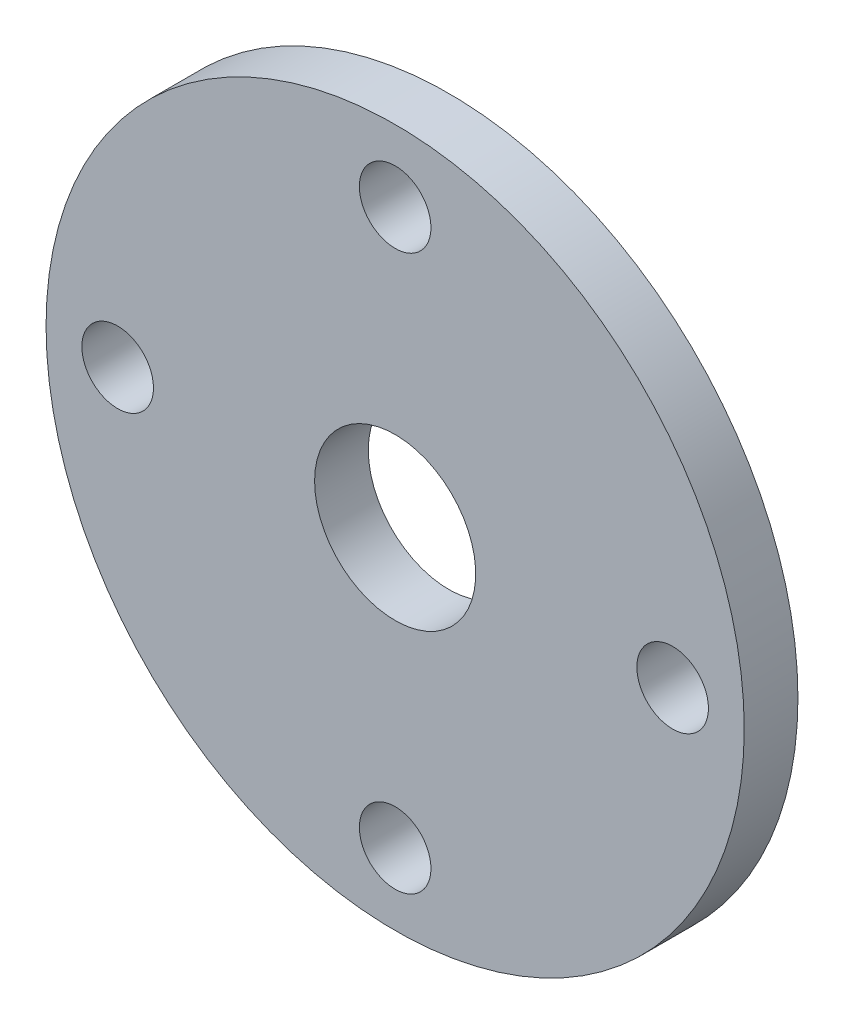
ISO-10303-21;
HEADER;
FILE_DESCRIPTION(('STEP AP214'),'2;1');
FILE_NAME('part.step','',(''),(''),'','','');
FILE_SCHEMA(('AUTOMOTIVE_DESIGN { 1 0 10303 214 1 1 1 1 }'));
ENDSEC;
DATA;
#1=APPLICATION_CONTEXT('core data for automotive mechanical design processes');
#2=APPLICATION_PROTOCOL_DEFINITION('international standard','automotive_design',2000,#1);
#3=PRODUCT_CONTEXT('',#1,'mechanical');
#4=PRODUCT('Part','Part','',(#3));
#5=PRODUCT_RELATED_PRODUCT_CATEGORY('part','',(#4));
#6=PRODUCT_DEFINITION_FORMATION('','',#4);
#7=PRODUCT_DEFINITION_CONTEXT('part definition',#1,'design');
#8=PRODUCT_DEFINITION('design','',#6,#7);
#9=PRODUCT_DEFINITION_SHAPE('','',#8);
#10=(LENGTH_UNIT() NAMED_UNIT(*) SI_UNIT(.MILLI.,.METRE.));
#11=(NAMED_UNIT(*) PLANE_ANGLE_UNIT() SI_UNIT($,.RADIAN.));
#12=(NAMED_UNIT(*) SI_UNIT($,.STERADIAN.) SOLID_ANGLE_UNIT());
#13=UNCERTAINTY_MEASURE_WITH_UNIT(LENGTH_MEASURE(1.E-05),#10,'distance_accuracy_value','');
#14=(GEOMETRIC_REPRESENTATION_CONTEXT(3) GLOBAL_UNCERTAINTY_ASSIGNED_CONTEXT((#13)) GLOBAL_UNIT_ASSIGNED_CONTEXT((#10,
#11,#12)) REPRESENTATION_CONTEXT('',''));
#15=CARTESIAN_POINT('',(0.,0.,0.));
#16=DIRECTION('',(0.,0.,1.));
#17=DIRECTION('',(1.,0.,0.));
#18=AXIS2_PLACEMENT_3D('',#15,#16,#17);
#19=CARTESIAN_POINT('',(0.,0.,3.));
#20=DIRECTION('',(0.,0.,1.));
#21=DIRECTION('',(1.,0.,0.));
#22=AXIS2_PLACEMENT_3D('',#19,#20,#21);
#23=PLANE('',#22);
#24=CARTESIAN_POINT('',(0.,0.,3.));
#25=DIRECTION('',(0.,0.,-1.));
#26=DIRECTION('',(-1.,0.,0.));
#27=AXIS2_PLACEMENT_3D('',#24,#25,#26);
#28=CIRCLE('',#27,4.5);
#29=CARTESIAN_POINT('',(-4.5,0.,3.));
#30=VERTEX_POINT('',#29);
#31=EDGE_CURVE('E74',#30,#30,#28,.T.);
#32=ORIENTED_EDGE('',*,*,#31,.T.);
#33=EDGE_LOOP('',(#32));
#34=FACE_BOUND('',#33,.T.);
#35=CARTESIAN_POINT('',(0.,15.5,3.));
#36=DIRECTION('',(0.,0.,1.));
#37=DIRECTION('',(1.,0.,0.));
#38=AXIS2_PLACEMENT_3D('',#35,#36,#37);
#39=CIRCLE('',#38,2.);
#40=CARTESIAN_POINT('',(2.,15.5,3.));
#41=VERTEX_POINT('',#40);
#42=EDGE_CURVE('E57',#41,#41,#39,.T.);
#43=ORIENTED_EDGE('',*,*,#42,.F.);
#44=EDGE_LOOP('',(#43));
#45=FACE_BOUND('',#44,.T.);
#46=CARTESIAN_POINT('',(0.,-15.5,3.));
#47=DIRECTION('',(0.,0.,1.));
#48=DIRECTION('',(1.,0.,0.));
#49=AXIS2_PLACEMENT_3D('',#46,#47,#48);
#50=CIRCLE('',#49,2.);
#51=CARTESIAN_POINT('',(2.,-15.5,3.));
#52=VERTEX_POINT('',#51);
#53=EDGE_CURVE('E46',#52,#52,#50,.T.);
#54=ORIENTED_EDGE('',*,*,#53,.F.);
#55=EDGE_LOOP('',(#54));
#56=FACE_BOUND('',#55,.T.);
#57=CARTESIAN_POINT('',(0.,0.,3.));
#58=DIRECTION('',(0.,0.,1.));
#59=DIRECTION('',(1.,0.,0.));
#60=AXIS2_PLACEMENT_3D('',#57,#58,#59);
#61=CIRCLE('',#60,19.5);
#62=CARTESIAN_POINT('',(19.5,0.,3.));
#63=VERTEX_POINT('',#62);
#64=EDGE_CURVE('E10',#63,#63,#61,.T.);
#65=ORIENTED_EDGE('',*,*,#64,.T.);
#66=EDGE_LOOP('',(#65));
#67=FACE_BOUND('',#66,.T.);
#68=CARTESIAN_POINT('',(15.5,0.,3.));
#69=DIRECTION('',(0.,0.,1.));
#70=DIRECTION('',(1.,0.,0.));
#71=AXIS2_PLACEMENT_3D('',#68,#69,#70);
#72=CIRCLE('',#71,2.);
#73=CARTESIAN_POINT('',(17.5,0.,3.));
#74=VERTEX_POINT('',#73);
#75=EDGE_CURVE('E51',#74,#74,#72,.T.);
#76=ORIENTED_EDGE('',*,*,#75,.F.);
#77=EDGE_LOOP('',(#76));
#78=FACE_BOUND('',#77,.T.);
#79=CARTESIAN_POINT('',(-15.5,0.,3.));
#80=DIRECTION('',(0.,0.,1.));
#81=DIRECTION('',(1.,0.,0.));
#82=AXIS2_PLACEMENT_3D('',#79,#80,#81);
#83=CIRCLE('',#82,2.);
#84=CARTESIAN_POINT('',(-13.5,0.,3.));
#85=VERTEX_POINT('',#84);
#86=EDGE_CURVE('E63',#85,#85,#83,.T.);
#87=ORIENTED_EDGE('',*,*,#86,.F.);
#88=EDGE_LOOP('',(#87));
#89=FACE_BOUND('',#88,.T.);
#90=ADVANCED_FACE('F35',(#34,#45,#56,#67,#78,#89),#23,.T.);
#91=CARTESIAN_POINT('',(0.,0.,0.));
#92=DIRECTION('',(0.,0.,1.));
#93=DIRECTION('',(1.,0.,0.));
#94=AXIS2_PLACEMENT_3D('',#91,#92,#93);
#95=PLANE('',#94);
#96=CARTESIAN_POINT('',(0.,0.,0.));
#97=DIRECTION('',(0.,0.,-1.));
#98=DIRECTION('',(-1.,0.,0.));
#99=AXIS2_PLACEMENT_3D('',#96,#97,#98);
#100=CIRCLE('',#99,4.5);
#101=CARTESIAN_POINT('',(-4.5,0.,0.));
#102=VERTEX_POINT('',#101);
#103=EDGE_CURVE('E69',#102,#102,#100,.T.);
#104=ORIENTED_EDGE('',*,*,#103,.F.);
#105=EDGE_LOOP('',(#104));
#106=FACE_BOUND('',#105,.T.);
#107=CARTESIAN_POINT('',(0.,0.,0.));
#108=DIRECTION('',(0.,0.,1.));
#109=DIRECTION('',(1.,0.,0.));
#110=AXIS2_PLACEMENT_3D('',#107,#108,#109);
#111=CIRCLE('',#110,19.5);
#112=CARTESIAN_POINT('',(19.5,0.,0.));
#113=VERTEX_POINT('',#112);
#114=EDGE_CURVE('E39',#113,#113,#111,.T.);
#115=ORIENTED_EDGE('',*,*,#114,.F.);
#116=EDGE_LOOP('',(#115));
#117=FACE_BOUND('',#116,.T.);
#118=CARTESIAN_POINT('',(0.,-15.5,0.));
#119=DIRECTION('',(0.,0.,1.));
#120=DIRECTION('',(1.,0.,0.));
#121=AXIS2_PLACEMENT_3D('',#118,#119,#120);
#122=CIRCLE('',#121,2.);
#123=CARTESIAN_POINT('',(2.,-15.5,0.));
#124=VERTEX_POINT('',#123);
#125=EDGE_CURVE('E48',#124,#124,#122,.T.);
#126=ORIENTED_EDGE('',*,*,#125,.T.);
#127=EDGE_LOOP('',(#126));
#128=FACE_BOUND('',#127,.T.);
#129=CARTESIAN_POINT('',(15.5,0.,0.));
#130=DIRECTION('',(0.,0.,1.));
#131=DIRECTION('',(1.,0.,0.));
#132=AXIS2_PLACEMENT_3D('',#129,#130,#131);
#133=CIRCLE('',#132,2.);
#134=CARTESIAN_POINT('',(17.5,0.,0.));
#135=VERTEX_POINT('',#134);
#136=EDGE_CURVE('E54',#135,#135,#133,.T.);
#137=ORIENTED_EDGE('',*,*,#136,.T.);
#138=EDGE_LOOP('',(#137));
#139=FACE_BOUND('',#138,.T.);
#140=CARTESIAN_POINT('',(0.,15.5,0.));
#141=DIRECTION('',(0.,0.,1.));
#142=DIRECTION('',(1.,0.,0.));
#143=AXIS2_PLACEMENT_3D('',#140,#141,#142);
#144=CIRCLE('',#143,2.);
#145=CARTESIAN_POINT('',(2.,15.5,0.));
#146=VERTEX_POINT('',#145);
#147=EDGE_CURVE('E60',#146,#146,#144,.T.);
#148=ORIENTED_EDGE('',*,*,#147,.T.);
#149=EDGE_LOOP('',(#148));
#150=FACE_BOUND('',#149,.T.);
#151=CARTESIAN_POINT('',(-15.5,0.,0.));
#152=DIRECTION('',(0.,0.,1.));
#153=DIRECTION('',(1.,0.,0.));
#154=AXIS2_PLACEMENT_3D('',#151,#152,#153);
#155=CIRCLE('',#154,2.);
#156=CARTESIAN_POINT('',(-13.5,0.,0.));
#157=VERTEX_POINT('',#156);
#158=EDGE_CURVE('E66',#157,#157,#155,.T.);
#159=ORIENTED_EDGE('',*,*,#158,.T.);
#160=EDGE_LOOP('',(#159));
#161=FACE_BOUND('',#160,.T.);
#162=ADVANCED_FACE('F92',(#106,#117,#128,#139,#150,#161),#95,.F.);
#163=CARTESIAN_POINT('',(0.,0.,3.));
#164=DIRECTION('',(0.,0.,-1.));
#165=DIRECTION('',(-1.,0.,0.));
#166=AXIS2_PLACEMENT_3D('',#163,#164,#165);
#167=CYLINDRICAL_SURFACE('',#166,19.5);
#168=ORIENTED_EDGE('',*,*,#64,.F.);
#169=EDGE_LOOP('',(#168));
#170=FACE_BOUND('',#169,.T.);
#171=ORIENTED_EDGE('',*,*,#114,.T.);
#172=EDGE_LOOP('',(#171));
#173=FACE_BOUND('',#172,.T.);
#174=ADVANCED_FACE('F37',(#170,#173),#167,.T.);
#175=CARTESIAN_POINT('',(0.,-15.5,3.));
#176=DIRECTION('',(0.,0.,-1.));
#177=DIRECTION('',(-1.,0.,0.));
#178=AXIS2_PLACEMENT_3D('',#175,#176,#177);
#179=CYLINDRICAL_SURFACE('',#178,2.);
#180=ORIENTED_EDGE('',*,*,#53,.T.);
#181=EDGE_LOOP('',(#180));
#182=FACE_BOUND('',#181,.T.);
#183=ORIENTED_EDGE('',*,*,#125,.F.);
#184=EDGE_LOOP('',(#183));
#185=FACE_BOUND('',#184,.T.);
#186=ADVANCED_FACE('F99',(#182,#185),#179,.F.);
#187=CARTESIAN_POINT('',(15.5,0.,3.));
#188=DIRECTION('',(0.,0.,-1.));
#189=DIRECTION('',(-1.,0.,0.));
#190=AXIS2_PLACEMENT_3D('',#187,#188,#189);
#191=CYLINDRICAL_SURFACE('',#190,2.);
#192=ORIENTED_EDGE('',*,*,#75,.T.);
#193=EDGE_LOOP('',(#192));
#194=FACE_BOUND('',#193,.T.);
#195=ORIENTED_EDGE('',*,*,#136,.F.);
#196=EDGE_LOOP('',(#195));
#197=FACE_BOUND('',#196,.T.);
#198=ADVANCED_FACE('F102',(#194,#197),#191,.F.);
#199=CARTESIAN_POINT('',(0.,15.5,3.));
#200=DIRECTION('',(0.,0.,-1.));
#201=DIRECTION('',(-1.,0.,0.));
#202=AXIS2_PLACEMENT_3D('',#199,#200,#201);
#203=CYLINDRICAL_SURFACE('',#202,2.);
#204=ORIENTED_EDGE('',*,*,#42,.T.);
#205=EDGE_LOOP('',(#204));
#206=FACE_BOUND('',#205,.T.);
#207=ORIENTED_EDGE('',*,*,#147,.F.);
#208=EDGE_LOOP('',(#207));
#209=FACE_BOUND('',#208,.T.);
#210=ADVANCED_FACE('F88',(#206,#209),#203,.F.);
#211=CARTESIAN_POINT('',(-15.5,0.,3.));
#212=DIRECTION('',(0.,0.,-1.));
#213=DIRECTION('',(-1.,0.,0.));
#214=AXIS2_PLACEMENT_3D('',#211,#212,#213);
#215=CYLINDRICAL_SURFACE('',#214,2.);
#216=ORIENTED_EDGE('',*,*,#86,.T.);
#217=EDGE_LOOP('',(#216));
#218=FACE_BOUND('',#217,.T.);
#219=ORIENTED_EDGE('',*,*,#158,.F.);
#220=EDGE_LOOP('',(#219));
#221=FACE_BOUND('',#220,.T.);
#222=ADVANCED_FACE('F82',(#218,#221),#215,.F.);
#223=CARTESIAN_POINT('',(0.,0.,1.));
#224=DIRECTION('',(0.,0.,-1.));
#225=DIRECTION('',(-1.,0.,0.));
#226=AXIS2_PLACEMENT_3D('',#223,#224,#225);
#227=CYLINDRICAL_SURFACE('',#226,4.5);
#228=ORIENTED_EDGE('',*,*,#103,.T.);
#229=EDGE_LOOP('',(#228));
#230=FACE_BOUND('',#229,.T.);
#231=ORIENTED_EDGE('',*,*,#31,.F.);
#232=EDGE_LOOP('',(#231));
#233=FACE_BOUND('',#232,.T.);
#234=ADVANCED_FACE('F80',(#230,#233),#227,.F.);
#235=CLOSED_SHELL('',(#90,#162,#174,#186,#198,#210,#222,#234));
#236=MANIFOLD_SOLID_BREP('B2',#235);
#237=ADVANCED_BREP_SHAPE_REPRESENTATION('',(#18,#236),#14);
#238=SHAPE_DEFINITION_REPRESENTATION(#9,#237);
ENDSEC;
END-ISO-10303-21;
